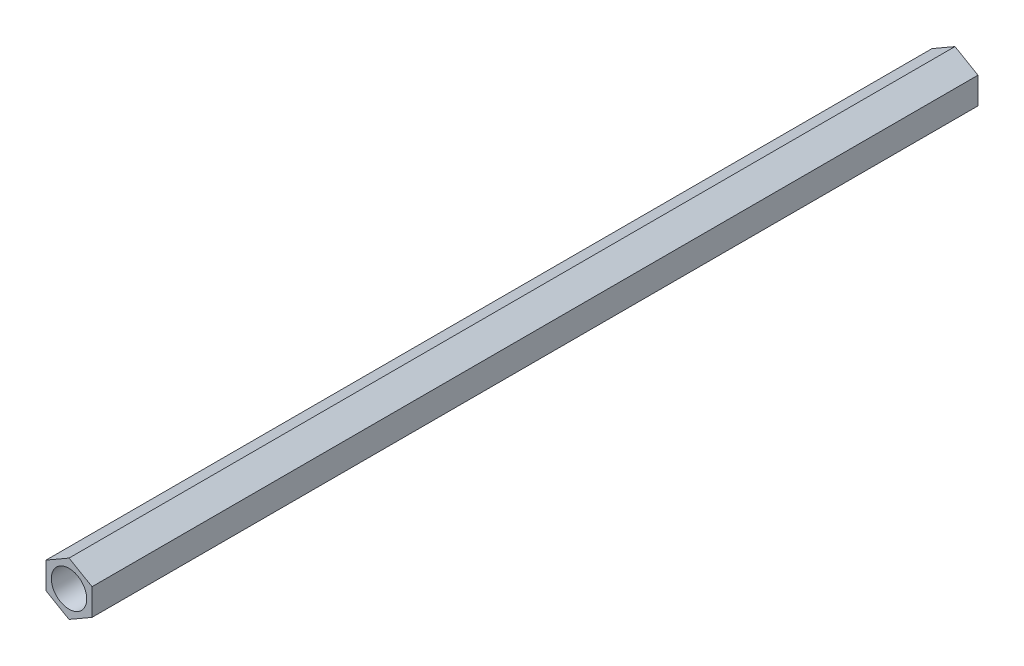
ISO-10303-21;
HEADER;
FILE_DESCRIPTION(('STEP AP214'),'2;1');
FILE_NAME('part.step','',(''),(''),'','','');
FILE_SCHEMA(('AUTOMOTIVE_DESIGN { 1 0 10303 214 1 1 1 1 }'));
ENDSEC;
DATA;
#1=APPLICATION_CONTEXT('core data for automotive mechanical design processes');
#2=APPLICATION_PROTOCOL_DEFINITION('international standard','automotive_design',2000,#1);
#3=PRODUCT_CONTEXT('',#1,'mechanical');
#4=PRODUCT('Part','Part','',(#3));
#5=PRODUCT_RELATED_PRODUCT_CATEGORY('part','',(#4));
#6=PRODUCT_DEFINITION_FORMATION('','',#4);
#7=PRODUCT_DEFINITION_CONTEXT('part definition',#1,'design');
#8=PRODUCT_DEFINITION('design','',#6,#7);
#9=PRODUCT_DEFINITION_SHAPE('','',#8);
#10=(LENGTH_UNIT() NAMED_UNIT(*) SI_UNIT(.MILLI.,.METRE.));
#11=(NAMED_UNIT(*) PLANE_ANGLE_UNIT() SI_UNIT($,.RADIAN.));
#12=(NAMED_UNIT(*) SI_UNIT($,.STERADIAN.) SOLID_ANGLE_UNIT());
#13=UNCERTAINTY_MEASURE_WITH_UNIT(LENGTH_MEASURE(1.E-05),#10,'distance_accuracy_value','');
#14=(GEOMETRIC_REPRESENTATION_CONTEXT(3) GLOBAL_UNCERTAINTY_ASSIGNED_CONTEXT((#13)) GLOBAL_UNIT_ASSIGNED_CONTEXT((#10,
#11,#12)) REPRESENTATION_CONTEXT('',''));
#15=CARTESIAN_POINT('',(0.,0.,0.));
#16=DIRECTION('',(0.,0.,1.));
#17=DIRECTION('',(1.,0.,0.));
#18=AXIS2_PLACEMENT_3D('',#15,#16,#17);
#19=CARTESIAN_POINT('',(2.5980762113533,1.50000000000003,100.));
#20=DIRECTION('',(-0.499999999999995,-0.866025403784441,0.));
#21=DIRECTION('',(0.866025403784441,-0.499999999999995,0.));
#22=AXIS2_PLACEMENT_3D('',#19,#20,#21);
#23=PLANE('',#22);
#24=DIRECTION('',(-0.866025403784441,0.499999999999995,0.));
#25=VECTOR('',#24,1.);
#26=CARTESIAN_POINT('',(2.5980762113533,1.50000000000003,0.));
#27=LINE('',#26,#25);
#28=CARTESIAN_POINT('',(2.5980762113533,1.50000000000003,0.));
#29=VERTEX_POINT('',#28);
#30=CARTESIAN_POINT('',(0.,3.,0.));
#31=VERTEX_POINT('',#30);
#32=EDGE_CURVE('E126',#29,#31,#27,.T.);
#33=ORIENTED_EDGE('',*,*,#32,.T.);
#34=DIRECTION('',(0.,0.,-1.));
#35=VECTOR('',#34,1.);
#36=CARTESIAN_POINT('',(0.,3.,100.));
#37=LINE('',#36,#35);
#38=CARTESIAN_POINT('',(0.,3.,100.));
#39=VERTEX_POINT('',#38);
#40=EDGE_CURVE('E11',#39,#31,#37,.T.);
#41=ORIENTED_EDGE('',*,*,#40,.F.);
#42=DIRECTION('',(-0.866025403784441,0.499999999999995,0.));
#43=VECTOR('',#42,1.);
#44=CARTESIAN_POINT('',(2.5980762113533,1.50000000000003,100.));
#45=LINE('',#44,#43);
#46=CARTESIAN_POINT('',(2.5980762113533,1.50000000000003,100.));
#47=VERTEX_POINT('',#46);
#48=EDGE_CURVE('E136',#47,#39,#45,.T.);
#49=ORIENTED_EDGE('',*,*,#48,.F.);
#50=DIRECTION('',(0.,0.,-1.));
#51=VECTOR('',#50,1.);
#52=CARTESIAN_POINT('',(2.5980762113533,1.50000000000003,100.));
#53=LINE('',#52,#51);
#54=EDGE_CURVE('E122',#47,#29,#53,.T.);
#55=ORIENTED_EDGE('',*,*,#54,.T.);
#56=EDGE_LOOP('',(#33,#41,#49,#55));
#57=FACE_BOUND('',#56,.T.);
#58=ADVANCED_FACE('F41',(#57),#23,.F.);
#59=CARTESIAN_POINT('',(0.,3.,100.));
#60=DIRECTION('',(0.500000000000001,-0.866025403784438,0.));
#61=DIRECTION('',(0.866025403784438,0.500000000000001,0.));
#62=AXIS2_PLACEMENT_3D('',#59,#60,#61);
#63=PLANE('',#62);
#64=DIRECTION('',(-0.866025403784438,-0.500000000000001,0.));
#65=VECTOR('',#64,1.);
#66=CARTESIAN_POINT('',(0.,3.,0.));
#67=LINE('',#66,#65);
#68=CARTESIAN_POINT('',(-2.59807621135332,1.49999999999999,0.));
#69=VERTEX_POINT('',#68);
#70=EDGE_CURVE('E129',#31,#69,#67,.T.);
#71=ORIENTED_EDGE('',*,*,#70,.T.);
#72=DIRECTION('',(0.,0.,-1.));
#73=VECTOR('',#72,1.);
#74=CARTESIAN_POINT('',(-2.59807621135332,1.49999999999999,100.));
#75=LINE('',#74,#73);
#76=CARTESIAN_POINT('',(-2.59807621135332,1.49999999999999,100.));
#77=VERTEX_POINT('',#76);
#78=EDGE_CURVE('E50',#77,#69,#75,.T.);
#79=ORIENTED_EDGE('',*,*,#78,.F.);
#80=DIRECTION('',(-0.866025403784438,-0.500000000000001,0.));
#81=VECTOR('',#80,1.);
#82=CARTESIAN_POINT('',(0.,3.,100.));
#83=LINE('',#82,#81);
#84=EDGE_CURVE('E95',#39,#77,#83,.T.);
#85=ORIENTED_EDGE('',*,*,#84,.F.);
#86=ORIENTED_EDGE('',*,*,#40,.T.);
#87=EDGE_LOOP('',(#71,#79,#85,#86));
#88=FACE_BOUND('',#87,.T.);
#89=ADVANCED_FACE('F162',(#88),#63,.F.);
#90=CARTESIAN_POINT('',(-2.59807621135332,1.49999999999999,100.));
#91=DIRECTION('',(1.,0.,0.));
#92=DIRECTION('',(0.,1.,0.));
#93=AXIS2_PLACEMENT_3D('',#90,#91,#92);
#94=PLANE('',#93);
#95=DIRECTION('',(0.,-1.,0.));
#96=VECTOR('',#95,1.);
#97=CARTESIAN_POINT('',(-2.59807621135332,1.49999999999999,0.));
#98=LINE('',#97,#96);
#99=CARTESIAN_POINT('',(-2.59807621135331,-1.50000000000001,0.));
#100=VERTEX_POINT('',#99);
#101=EDGE_CURVE('E131',#69,#100,#98,.T.);
#102=ORIENTED_EDGE('',*,*,#101,.T.);
#103=DIRECTION('',(0.,0.,-1.));
#104=VECTOR('',#103,1.);
#105=CARTESIAN_POINT('',(-2.59807621135331,-1.50000000000001,100.));
#106=LINE('',#105,#104);
#107=CARTESIAN_POINT('',(-2.59807621135331,-1.50000000000001,100.));
#108=VERTEX_POINT('',#107);
#109=EDGE_CURVE('E117',#108,#100,#106,.T.);
#110=ORIENTED_EDGE('',*,*,#109,.F.);
#111=DIRECTION('',(0.,-1.,0.));
#112=VECTOR('',#111,1.);
#113=CARTESIAN_POINT('',(-2.59807621135332,1.49999999999999,100.));
#114=LINE('',#113,#112);
#115=EDGE_CURVE('E108',#77,#108,#114,.T.);
#116=ORIENTED_EDGE('',*,*,#115,.F.);
#117=ORIENTED_EDGE('',*,*,#78,.T.);
#118=EDGE_LOOP('',(#102,#110,#116,#117));
#119=FACE_BOUND('',#118,.T.);
#120=ADVANCED_FACE('F143',(#119),#94,.F.);
#121=CARTESIAN_POINT('',(-2.59807621135331,-1.50000000000001,100.));
#122=DIRECTION('',(0.499999999999995,0.866025403784442,0.));
#123=DIRECTION('',(-0.866025403784442,0.499999999999995,0.));
#124=AXIS2_PLACEMENT_3D('',#121,#122,#123);
#125=PLANE('',#124);
#126=DIRECTION('',(0.866025403784442,-0.499999999999995,0.));
#127=VECTOR('',#126,1.);
#128=CARTESIAN_POINT('',(-2.59807621135331,-1.50000000000001,0.));
#129=LINE('',#128,#127);
#130=CARTESIAN_POINT('',(0.,-3.,0.));
#131=VERTEX_POINT('',#130);
#132=EDGE_CURVE('E116',#100,#131,#129,.T.);
#133=ORIENTED_EDGE('',*,*,#132,.T.);
#134=DIRECTION('',(0.,0.,-1.));
#135=VECTOR('',#134,1.);
#136=CARTESIAN_POINT('',(0.,-3.,100.));
#137=LINE('',#136,#135);
#138=CARTESIAN_POINT('',(0.,-3.,100.));
#139=VERTEX_POINT('',#138);
#140=EDGE_CURVE('E113',#139,#131,#137,.T.);
#141=ORIENTED_EDGE('',*,*,#140,.F.);
#142=DIRECTION('',(0.866025403784442,-0.499999999999995,0.));
#143=VECTOR('',#142,1.);
#144=CARTESIAN_POINT('',(-2.59807621135331,-1.50000000000001,100.));
#145=LINE('',#144,#143);
#146=EDGE_CURVE('E102',#108,#139,#145,.T.);
#147=ORIENTED_EDGE('',*,*,#146,.F.);
#148=ORIENTED_EDGE('',*,*,#109,.T.);
#149=EDGE_LOOP('',(#133,#141,#147,#148));
#150=FACE_BOUND('',#149,.T.);
#151=ADVANCED_FACE('F114',(#150),#125,.F.);
#152=CARTESIAN_POINT('',(0.,-3.,100.));
#153=DIRECTION('',(-0.500000000000007,0.866025403784435,0.));
#154=DIRECTION('',(-0.866025403784435,-0.500000000000007,0.));
#155=AXIS2_PLACEMENT_3D('',#152,#153,#154);
#156=PLANE('',#155);
#157=DIRECTION('',(0.866025403784435,0.500000000000007,0.));
#158=VECTOR('',#157,1.);
#159=CARTESIAN_POINT('',(0.,-3.,0.));
#160=LINE('',#159,#158);
#161=CARTESIAN_POINT('',(2.59807621135333,-1.49999999999998,0.));
#162=VERTEX_POINT('',#161);
#163=EDGE_CURVE('E81',#131,#162,#160,.T.);
#164=ORIENTED_EDGE('',*,*,#163,.T.);
#165=DIRECTION('',(0.,0.,-1.));
#166=VECTOR('',#165,1.);
#167=CARTESIAN_POINT('',(2.59807621135333,-1.49999999999998,100.));
#168=LINE('',#167,#166);
#169=CARTESIAN_POINT('',(2.59807621135333,-1.49999999999998,100.));
#170=VERTEX_POINT('',#169);
#171=EDGE_CURVE('E118',#170,#162,#168,.T.);
#172=ORIENTED_EDGE('',*,*,#171,.F.);
#173=DIRECTION('',(0.866025403784435,0.500000000000007,0.));
#174=VECTOR('',#173,1.);
#175=CARTESIAN_POINT('',(0.,-3.,100.));
#176=LINE('',#175,#174);
#177=EDGE_CURVE('E106',#139,#170,#176,.T.);
#178=ORIENTED_EDGE('',*,*,#177,.F.);
#179=ORIENTED_EDGE('',*,*,#140,.T.);
#180=EDGE_LOOP('',(#164,#172,#178,#179));
#181=FACE_BOUND('',#180,.T.);
#182=ADVANCED_FACE('F120',(#181),#156,.F.);
#183=CARTESIAN_POINT('',(2.59807621135333,-1.49999999999998,100.));
#184=DIRECTION('',(-1.,0.,0.));
#185=DIRECTION('',(0.,-1.,0.));
#186=AXIS2_PLACEMENT_3D('',#183,#184,#185);
#187=PLANE('',#186);
#188=DIRECTION('',(0.,1.,0.));
#189=VECTOR('',#188,1.);
#190=CARTESIAN_POINT('',(2.59807621135333,-1.49999999999998,0.));
#191=LINE('',#190,#189);
#192=EDGE_CURVE('E87',#162,#29,#191,.T.);
#193=ORIENTED_EDGE('',*,*,#192,.T.);
#194=ORIENTED_EDGE('',*,*,#54,.F.);
#195=DIRECTION('',(0.,1.,0.));
#196=VECTOR('',#195,1.);
#197=CARTESIAN_POINT('',(2.59807621135333,-1.49999999999998,100.));
#198=LINE('',#197,#196);
#199=EDGE_CURVE('E58',#170,#47,#198,.T.);
#200=ORIENTED_EDGE('',*,*,#199,.F.);
#201=ORIENTED_EDGE('',*,*,#171,.T.);
#202=EDGE_LOOP('',(#193,#194,#200,#201));
#203=FACE_BOUND('',#202,.T.);
#204=ADVANCED_FACE('F150',(#203),#187,.F.);
#205=CARTESIAN_POINT('',(0.,0.,100.));
#206=DIRECTION('',(0.,0.,1.));
#207=DIRECTION('',(1.,0.,0.));
#208=AXIS2_PLACEMENT_3D('',#205,#206,#207);
#209=PLANE('',#208);
#210=CARTESIAN_POINT('',(0.,0.,100.));
#211=DIRECTION('',(0.,0.,1.));
#212=DIRECTION('',(1.,0.,0.));
#213=AXIS2_PLACEMENT_3D('',#210,#211,#212);
#214=CIRCLE('',#213,2.);
#215=CARTESIAN_POINT('',(2.,0.,100.));
#216=VERTEX_POINT('',#215);
#217=EDGE_CURVE('E216',#216,#216,#214,.T.);
#218=ORIENTED_EDGE('',*,*,#217,.F.);
#219=EDGE_LOOP('',(#218));
#220=FACE_BOUND('',#219,.T.);
#221=ORIENTED_EDGE('',*,*,#48,.T.);
#222=ORIENTED_EDGE('',*,*,#84,.T.);
#223=ORIENTED_EDGE('',*,*,#115,.T.);
#224=ORIENTED_EDGE('',*,*,#146,.T.);
#225=ORIENTED_EDGE('',*,*,#177,.T.);
#226=ORIENTED_EDGE('',*,*,#199,.T.);
#227=EDGE_LOOP('',(#221,#222,#223,#224,#225,#226));
#228=FACE_BOUND('',#227,.T.);
#229=ADVANCED_FACE('F104',(#220,#228),#209,.T.);
#230=CARTESIAN_POINT('',(0.,0.,0.));
#231=DIRECTION('',(0.,0.,1.));
#232=DIRECTION('',(1.,0.,0.));
#233=AXIS2_PLACEMENT_3D('',#230,#231,#232);
#234=PLANE('',#233);
#235=CARTESIAN_POINT('',(0.,0.,0.));
#236=DIRECTION('',(0.,0.,1.));
#237=DIRECTION('',(1.,0.,0.));
#238=AXIS2_PLACEMENT_3D('',#235,#236,#237);
#239=CIRCLE('',#238,2.);
#240=CARTESIAN_POINT('',(2.,0.,0.));
#241=VERTEX_POINT('',#240);
#242=EDGE_CURVE('E44',#241,#241,#239,.T.);
#243=ORIENTED_EDGE('',*,*,#242,.T.);
#244=EDGE_LOOP('',(#243));
#245=FACE_BOUND('',#244,.T.);
#246=ORIENTED_EDGE('',*,*,#32,.F.);
#247=ORIENTED_EDGE('',*,*,#192,.F.);
#248=ORIENTED_EDGE('',*,*,#163,.F.);
#249=ORIENTED_EDGE('',*,*,#132,.F.);
#250=ORIENTED_EDGE('',*,*,#101,.F.);
#251=ORIENTED_EDGE('',*,*,#70,.F.);
#252=EDGE_LOOP('',(#246,#247,#248,#249,#250,#251));
#253=FACE_BOUND('',#252,.T.);
#254=ADVANCED_FACE('F146',(#245,#253),#234,.F.);
#255=CARTESIAN_POINT('',(0.,0.,-20.));
#256=DIRECTION('',(0.,0.,1.));
#257=DIRECTION('',(1.,0.,0.));
#258=AXIS2_PLACEMENT_3D('',#255,#256,#257);
#259=CYLINDRICAL_SURFACE('',#258,2.);
#260=CARTESIAN_POINT('',(2.,0.,100.));
#261=CARTESIAN_POINT('',(2.,0.,98.9583333333333));
#262=CARTESIAN_POINT('',(2.,0.,97.9166666666667));
#263=CARTESIAN_POINT('',(2.,0.,95.8333333333333));
#264=CARTESIAN_POINT('',(2.,0.,94.7916666666667));
#265=CARTESIAN_POINT('',(2.,0.,92.7083333333333));
#266=CARTESIAN_POINT('',(2.,0.,91.6666666666667));
#267=CARTESIAN_POINT('',(2.,0.,89.5833333333333));
#268=CARTESIAN_POINT('',(2.,0.,88.5416666666667));
#269=CARTESIAN_POINT('',(2.,0.,86.4583333333333));
#270=CARTESIAN_POINT('',(2.,0.,85.4166666666667));
#271=CARTESIAN_POINT('',(2.,0.,83.3333333333333));
#272=CARTESIAN_POINT('',(2.,0.,82.2916666666667));
#273=CARTESIAN_POINT('',(2.,0.,80.2083333333333));
#274=CARTESIAN_POINT('',(2.,0.,79.1666666666667));
#275=CARTESIAN_POINT('',(2.,0.,77.0833333333333));
#276=CARTESIAN_POINT('',(2.,0.,76.0416666666667));
#277=CARTESIAN_POINT('',(2.,0.,73.9583333333333));
#278=CARTESIAN_POINT('',(2.,0.,72.9166666666667));
#279=CARTESIAN_POINT('',(2.,0.,70.8333333333333));
#280=CARTESIAN_POINT('',(2.,0.,69.7916666666667));
#281=CARTESIAN_POINT('',(2.,0.,67.7083333333333));
#282=CARTESIAN_POINT('',(2.,0.,66.6666666666667));
#283=CARTESIAN_POINT('',(2.,0.,64.5833333333333));
#284=CARTESIAN_POINT('',(2.,0.,63.5416666666667));
#285=CARTESIAN_POINT('',(2.,0.,61.4583333333333));
#286=CARTESIAN_POINT('',(2.,0.,60.4166666666667));
#287=CARTESIAN_POINT('',(2.,0.,58.3333333333333));
#288=CARTESIAN_POINT('',(2.,0.,57.2916666666667));
#289=CARTESIAN_POINT('',(2.,0.,55.2083333333333));
#290=CARTESIAN_POINT('',(2.,0.,54.1666666666667));
#291=CARTESIAN_POINT('',(2.,0.,52.0833333333333));
#292=CARTESIAN_POINT('',(2.,0.,51.0416666666667));
#293=CARTESIAN_POINT('',(2.,0.,48.9583333333333));
#294=CARTESIAN_POINT('',(2.,0.,47.9166666666667));
#295=CARTESIAN_POINT('',(2.,0.,45.8333333333333));
#296=CARTESIAN_POINT('',(2.,0.,44.7916666666667));
#297=CARTESIAN_POINT('',(2.,0.,42.7083333333333));
#298=CARTESIAN_POINT('',(2.,0.,41.6666666666667));
#299=CARTESIAN_POINT('',(2.,0.,39.5833333333333));
#300=CARTESIAN_POINT('',(2.,0.,38.5416666666667));
#301=CARTESIAN_POINT('',(2.,0.,36.4583333333333));
#302=CARTESIAN_POINT('',(2.,0.,35.4166666666667));
#303=CARTESIAN_POINT('',(2.,0.,33.3333333333333));
#304=CARTESIAN_POINT('',(2.,0.,32.2916666666667));
#305=CARTESIAN_POINT('',(2.,0.,30.2083333333333));
#306=CARTESIAN_POINT('',(2.,0.,29.1666666666667));
#307=CARTESIAN_POINT('',(2.,0.,27.0833333333333));
#308=CARTESIAN_POINT('',(2.,0.,26.0416666666667));
#309=CARTESIAN_POINT('',(2.,0.,23.9583333333333));
#310=CARTESIAN_POINT('',(2.,0.,22.9166666666667));
#311=CARTESIAN_POINT('',(2.,0.,20.8333333333333));
#312=CARTESIAN_POINT('',(2.,0.,19.7916666666667));
#313=CARTESIAN_POINT('',(2.,0.,17.7083333333333));
#314=CARTESIAN_POINT('',(2.,0.,16.6666666666667));
#315=CARTESIAN_POINT('',(2.,0.,14.5833333333333));
#316=CARTESIAN_POINT('',(2.,0.,13.5416666666667));
#317=CARTESIAN_POINT('',(2.,0.,11.4583333333333));
#318=CARTESIAN_POINT('',(2.,0.,10.4166666666667));
#319=CARTESIAN_POINT('',(2.,0.,8.33333333333334));
#320=CARTESIAN_POINT('',(2.,0.,7.29166666666667));
#321=CARTESIAN_POINT('',(2.,0.,5.20833333333333));
#322=CARTESIAN_POINT('',(2.,0.,4.16666666666667));
#323=CARTESIAN_POINT('',(2.,0.,2.08333333333333));
#324=CARTESIAN_POINT('',(2.,0.,1.04166666666666));
#325=CARTESIAN_POINT('',(2.,0.,0.));
#326=B_SPLINE_CURVE_WITH_KNOTS('',3,(#260,#261,#262,#263,#264,#265,#266,#267,#268,#269,#270,
#271,#272,#273,#274,#275,#276,#277,#278,#279,#280,#281,#282,#283,#284,#285,#286,#287,#288,#289,
#290,#291,#292,#293,#294,#295,#296,#297,#298,#299,#300,#301,#302,#303,#304,#305,#306,#307,#308,
#309,#310,#311,#312,#313,#314,#315,#316,#317,#318,#319,#320,#321,#322,#323,#324,#325),
.UNSPECIFIED.,.F.,.F.,(4,2,2,2,2,2,2,2,2,2,2,2,2,2,2,2,2,2,2,2,2,2,2,2,2,2,2,2,2,2,2,2,4),(0.,
3.125,6.25000000000001,9.37499999999999,12.5,15.625,18.75,21.875,25.,28.125,31.25,34.375,37.5,
40.625,43.75,46.875,50.,53.125,56.25,59.375,62.5,65.625,68.75,71.875,75.,78.125,81.25,84.375,
87.5,90.625,93.75,96.875,100.),.UNSPECIFIED.);
#327=EDGE_CURVE('BSEAM201',#216,#241,#326,.T.);
#328=ORIENTED_EDGE('',*,*,#217,.T.);
#329=ORIENTED_EDGE('',*,*,#242,.F.);
#330=ORIENTED_EDGE('',*,*,#327,.T.);
#331=ORIENTED_EDGE('',*,*,#327,.F.);
#332=EDGE_LOOP('',(#328,#330,#329,#331));
#333=FACE_BOUND('',#332,.T.);
#334=ADVANCED_FACE('F201',(#333),#259,.F.);
#335=CLOSED_SHELL('',(#58,#89,#120,#151,#182,#204,#229,#254,#334));
#336=MANIFOLD_SOLID_BREP('B2',#335);
#337=ADVANCED_BREP_SHAPE_REPRESENTATION('',(#18,#336),#14);
#338=SHAPE_DEFINITION_REPRESENTATION(#9,#337);
ENDSEC;
END-ISO-10303-21;
